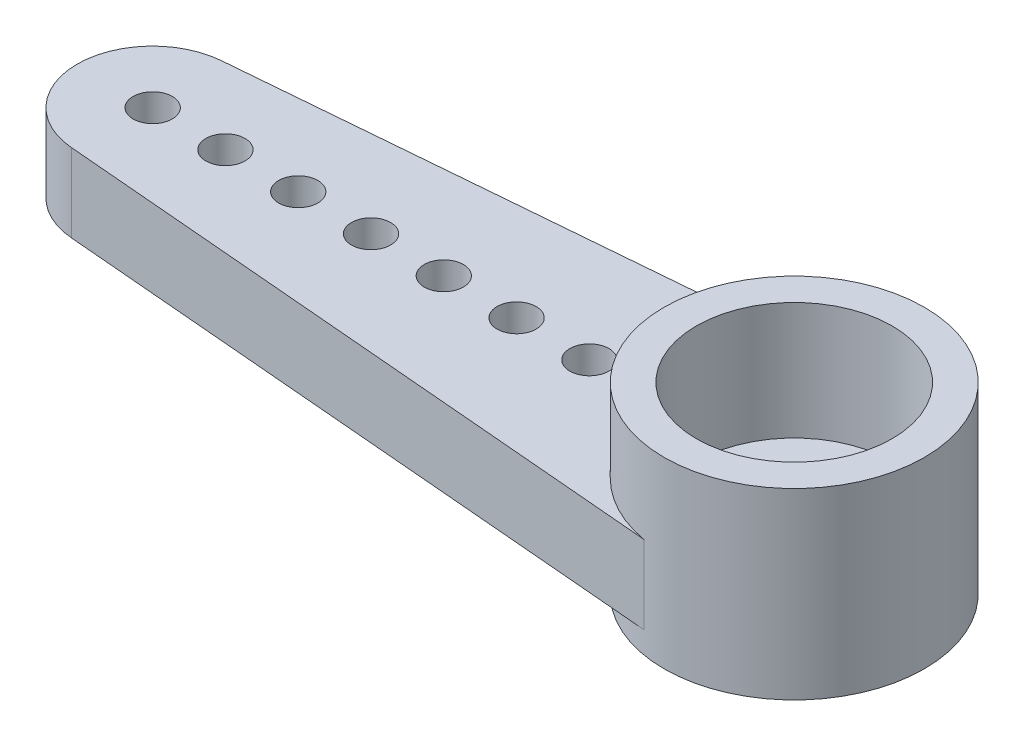
ISO-10303-21;
HEADER;
FILE_DESCRIPTION(('STEP AP214'),'2;1');
FILE_NAME('part.step','',(''),(''),'','','');
FILE_SCHEMA(('AUTOMOTIVE_DESIGN { 1 0 10303 214 1 1 1 1 }'));
ENDSEC;
DATA;
#1=APPLICATION_CONTEXT('core data for automotive mechanical design processes');
#2=APPLICATION_PROTOCOL_DEFINITION('international standard','automotive_design',2000,#1);
#3=PRODUCT_CONTEXT('',#1,'mechanical');
#4=PRODUCT('Part','Part','',(#3));
#5=PRODUCT_RELATED_PRODUCT_CATEGORY('part','',(#4));
#6=PRODUCT_DEFINITION_FORMATION('','',#4);
#7=PRODUCT_DEFINITION_CONTEXT('part definition',#1,'design');
#8=PRODUCT_DEFINITION('design','',#6,#7);
#9=PRODUCT_DEFINITION_SHAPE('','',#8);
#10=(LENGTH_UNIT() NAMED_UNIT(*) SI_UNIT(.MILLI.,.METRE.));
#11=(NAMED_UNIT(*) PLANE_ANGLE_UNIT() SI_UNIT($,.RADIAN.));
#12=(NAMED_UNIT(*) SI_UNIT($,.STERADIAN.) SOLID_ANGLE_UNIT());
#13=UNCERTAINTY_MEASURE_WITH_UNIT(LENGTH_MEASURE(1.E-05),#10,'distance_accuracy_value','');
#14=(GEOMETRIC_REPRESENTATION_CONTEXT(3) GLOBAL_UNCERTAINTY_ASSIGNED_CONTEXT((#13)) GLOBAL_UNIT_ASSIGNED_CONTEXT((#10,
#11,#12)) REPRESENTATION_CONTEXT('',''));
#15=CARTESIAN_POINT('',(0.,0.,0.));
#16=DIRECTION('',(0.,0.,1.));
#17=DIRECTION('',(1.,0.,0.));
#18=AXIS2_PLACEMENT_3D('',#15,#16,#17);
#19=CARTESIAN_POINT('',(0.,2.34,0.));
#20=DIRECTION('',(0.,-1.,0.));
#21=DIRECTION('',(0.,0.,-1.));
#22=AXIS2_PLACEMENT_3D('',#19,#20,#21);
#23=CYLINDRICAL_SURFACE('',#22,3.325);
#24=CARTESIAN_POINT('',(0.,-2.34,0.));
#25=DIRECTION('',(0.,1.,0.));
#26=DIRECTION('',(0.,0.,1.));
#27=AXIS2_PLACEMENT_3D('',#24,#25,#26);
#28=CIRCLE('',#27,3.325);
#29=CARTESIAN_POINT('',(0.,-2.34,3.325));
#30=VERTEX_POINT('',#29);
#31=EDGE_CURVE('E120',#30,#30,#28,.T.);
#32=ORIENTED_EDGE('',*,*,#31,.T.);
#33=EDGE_LOOP('',(#32));
#34=FACE_BOUND('',#33,.T.);
#35=CARTESIAN_POINT('',(0.,2.34,0.));
#36=DIRECTION('',(0.,1.,0.));
#37=DIRECTION('',(0.,0.,1.));
#38=AXIS2_PLACEMENT_3D('',#35,#36,#37);
#39=CIRCLE('',#38,3.325);
#40=CARTESIAN_POINT('',(0.,2.34,3.325));
#41=VERTEX_POINT('',#40);
#42=EDGE_CURVE('E123',#41,#41,#39,.T.);
#43=ORIENTED_EDGE('',*,*,#42,.F.);
#44=EDGE_LOOP('',(#43));
#45=FACE_BOUND('',#44,.T.);
#46=CARTESIAN_POINT('',(0.,-1.78,0.));
#47=DIRECTION('',(0.,1.,0.));
#48=DIRECTION('',(0.,0.,1.));
#49=AXIS2_PLACEMENT_3D('',#46,#47,#48);
#50=CIRCLE('',#49,3.325);
#51=CARTESIAN_POINT('',(-0.560507232356942,-1.78,-3.27741615338601));
#52=VERTEX_POINT('',#51);
#53=CARTESIAN_POINT('',(-0.560507232356942,-1.78,3.27741615338601));
#54=VERTEX_POINT('',#53);
#55=EDGE_CURVE('E11',#52,#54,#50,.T.);
#56=ORIENTED_EDGE('',*,*,#55,.F.);
#57=DIRECTION('',(0.,-1.,0.));
#58=VECTOR('',#57,1.);
#59=CARTESIAN_POINT('',(-0.560507232356942,2.34,-3.27741615338601));
#60=LINE('',#59,#58);
#61=CARTESIAN_POINT('',(-0.560507232356942,0.22,-3.27741615338601));
#62=VERTEX_POINT('',#61);
#63=EDGE_CURVE('E63',#62,#52,#60,.T.);
#64=ORIENTED_EDGE('',*,*,#63,.F.);
#65=CARTESIAN_POINT('',(0.,0.22,0.));
#66=DIRECTION('',(0.,1.,0.));
#67=DIRECTION('',(0.,0.,1.));
#68=AXIS2_PLACEMENT_3D('',#65,#66,#67);
#69=CIRCLE('',#68,3.325);
#70=CARTESIAN_POINT('',(-0.560507232356942,0.22,3.27741615338601));
#71=VERTEX_POINT('',#70);
#72=EDGE_CURVE('E126',#62,#71,#69,.T.);
#73=ORIENTED_EDGE('',*,*,#72,.T.);
#74=DIRECTION('',(0.,-1.,0.));
#75=VECTOR('',#74,1.);
#76=CARTESIAN_POINT('',(-0.560507232356942,2.34,3.27741615338601));
#77=LINE('',#76,#75);
#78=EDGE_CURVE('E47',#54,#71,#77,.F.);
#79=ORIENTED_EDGE('',*,*,#78,.F.);
#80=EDGE_LOOP('',(#56,#64,#73,#79));
#81=FACE_BOUND('',#80,.T.);
#82=ADVANCED_FACE('F39',(#34,#45,#81),#23,.T.);
#83=CARTESIAN_POINT('',(0.,2.34,0.));
#84=DIRECTION('',(0.,1.,0.));
#85=DIRECTION('',(0.,0.,1.));
#86=AXIS2_PLACEMENT_3D('',#83,#84,#85);
#87=PLANE('',#86);
#88=CARTESIAN_POINT('',(0.,2.34,0.));
#89=DIRECTION('',(0.,1.,0.));
#90=DIRECTION('',(0.,0.,1.));
#91=AXIS2_PLACEMENT_3D('',#88,#89,#90);
#92=CIRCLE('',#91,2.5);
#93=CARTESIAN_POINT('',(0.,2.34,2.5));
#94=VERTEX_POINT('',#93);
#95=EDGE_CURVE('E114',#94,#94,#92,.T.);
#96=ORIENTED_EDGE('',*,*,#95,.F.);
#97=EDGE_LOOP('',(#96));
#98=FACE_BOUND('',#97,.T.);
#99=ORIENTED_EDGE('',*,*,#42,.T.);
#100=EDGE_LOOP('',(#99));
#101=FACE_BOUND('',#100,.T.);
#102=ADVANCED_FACE('F177',(#98,#101),#87,.T.);
#103=CARTESIAN_POINT('',(0.,-2.34,0.));
#104=DIRECTION('',(0.,1.,0.));
#105=DIRECTION('',(0.,0.,1.));
#106=AXIS2_PLACEMENT_3D('',#103,#104,#105);
#107=PLANE('',#106);
#108=CARTESIAN_POINT('',(0.,-2.34,0.));
#109=DIRECTION('',(0.,1.,0.));
#110=DIRECTION('',(0.,0.,1.));
#111=AXIS2_PLACEMENT_3D('',#108,#109,#110);
#112=CIRCLE('',#111,1.);
#113=CARTESIAN_POINT('',(0.,-2.34,1.));
#114=VERTEX_POINT('',#113);
#115=EDGE_CURVE('E111',#114,#114,#112,.T.);
#116=ORIENTED_EDGE('',*,*,#115,.T.);
#117=EDGE_LOOP('',(#116));
#118=FACE_BOUND('',#117,.T.);
#119=ORIENTED_EDGE('',*,*,#31,.F.);
#120=EDGE_LOOP('',(#119));
#121=FACE_BOUND('',#120,.T.);
#122=ADVANCED_FACE('F184',(#118,#121),#107,.F.);
#123=CARTESIAN_POINT('',(0.,-0.66,0.));
#124=DIRECTION('',(0.,1.,0.));
#125=DIRECTION('',(0.,0.,1.));
#126=AXIS2_PLACEMENT_3D('',#123,#124,#125);
#127=CYLINDRICAL_SURFACE('',#126,2.5);
#128=CARTESIAN_POINT('',(0.,-0.66,0.));
#129=DIRECTION('',(0.,1.,0.));
#130=DIRECTION('',(0.,0.,1.));
#131=AXIS2_PLACEMENT_3D('',#128,#129,#130);
#132=CIRCLE('',#131,2.5);
#133=CARTESIAN_POINT('',(0.,-0.66,2.5));
#134=VERTEX_POINT('',#133);
#135=EDGE_CURVE('E117',#134,#134,#132,.T.);
#136=ORIENTED_EDGE('',*,*,#135,.F.);
#137=EDGE_LOOP('',(#136));
#138=FACE_BOUND('',#137,.T.);
#139=ORIENTED_EDGE('',*,*,#95,.T.);
#140=EDGE_LOOP('',(#139));
#141=FACE_BOUND('',#140,.T.);
#142=ADVANCED_FACE('F193',(#138,#141),#127,.F.);
#143=CARTESIAN_POINT('',(0.,-0.66,0.));
#144=DIRECTION('',(0.,1.,0.));
#145=DIRECTION('',(0.,0.,1.));
#146=AXIS2_PLACEMENT_3D('',#143,#144,#145);
#147=PLANE('',#146);
#148=CARTESIAN_POINT('',(0.,-0.66,0.));
#149=DIRECTION('',(0.,1.,0.));
#150=DIRECTION('',(0.,0.,1.));
#151=AXIS2_PLACEMENT_3D('',#148,#149,#150);
#152=CIRCLE('',#151,1.);
#153=CARTESIAN_POINT('',(0.,-0.66,1.));
#154=VERTEX_POINT('',#153);
#155=EDGE_CURVE('E96',#154,#154,#152,.T.);
#156=ORIENTED_EDGE('',*,*,#155,.F.);
#157=EDGE_LOOP('',(#156));
#158=FACE_BOUND('',#157,.T.);
#159=ORIENTED_EDGE('',*,*,#135,.T.);
#160=EDGE_LOOP('',(#159));
#161=FACE_BOUND('',#160,.T.);
#162=ADVANCED_FACE('F199',(#158,#161),#147,.T.);
#163=CARTESIAN_POINT('',(0.,-2.34,0.));
#164=DIRECTION('',(0.,1.,0.));
#165=DIRECTION('',(0.,0.,1.));
#166=AXIS2_PLACEMENT_3D('',#163,#164,#165);
#167=CYLINDRICAL_SURFACE('',#166,1.);
#168=ORIENTED_EDGE('',*,*,#115,.F.);
#169=EDGE_LOOP('',(#168));
#170=FACE_BOUND('',#169,.T.);
#171=ORIENTED_EDGE('',*,*,#155,.T.);
#172=EDGE_LOOP('',(#171));
#173=FACE_BOUND('',#172,.T.);
#174=ADVANCED_FACE('F204',(#170,#173),#167,.F.);
#175=CARTESIAN_POINT('',(0.,-1.78,3.325));
#176=DIRECTION('',(0.0845899855552582,0.,-0.996415844085069));
#177=DIRECTION('',(-0.996415844085069,0.,-0.0845899855552582));
#178=AXIS2_PLACEMENT_3D('',#175,#176,#177);
#179=PLANE('',#178);
#180=DIRECTION('',(-0.996415844085069,0.,-0.0845899855552582));
#181=VECTOR('',#180,1.);
#182=CARTESIAN_POINT('',(0.,-1.78,3.325));
#183=LINE('',#182,#181);
#184=CARTESIAN_POINT('',(-16.55,-1.78,1.92));
#185=VERTEX_POINT('',#184);
#186=EDGE_CURVE('E81',#54,#185,#183,.T.);
#187=ORIENTED_EDGE('',*,*,#186,.F.);
#188=ORIENTED_EDGE('',*,*,#78,.T.);
#189=DIRECTION('',(-0.996415844085069,0.,-0.0845899855552582));
#190=VECTOR('',#189,1.);
#191=CARTESIAN_POINT('',(0.,0.22,3.325));
#192=LINE('',#191,#190);
#193=CARTESIAN_POINT('',(-16.55,0.22,1.92));
#194=VERTEX_POINT('',#193);
#195=EDGE_CURVE('E55',#71,#194,#192,.T.);
#196=ORIENTED_EDGE('',*,*,#195,.T.);
#197=DIRECTION('',(0.,1.,0.));
#198=VECTOR('',#197,1.);
#199=CARTESIAN_POINT('',(-16.55,-1.78,1.92));
#200=LINE('',#199,#198);
#201=EDGE_CURVE('E93',#185,#194,#200,.T.);
#202=ORIENTED_EDGE('',*,*,#201,.F.);
#203=EDGE_LOOP('',(#187,#188,#196,#202));
#204=FACE_BOUND('',#203,.T.);
#205=ADVANCED_FACE('F94',(#204),#179,.F.);
#206=CARTESIAN_POINT('',(0.,-1.78,-3.325));
#207=DIRECTION('',(0.0845899855552582,0.,0.996415844085069));
#208=DIRECTION('',(0.996415844085069,0.,-0.0845899855552582));
#209=AXIS2_PLACEMENT_3D('',#206,#207,#208);
#210=PLANE('',#209);
#211=DIRECTION('',(0.996415844085069,0.,-0.0845899855552582));
#212=VECTOR('',#211,1.);
#213=CARTESIAN_POINT('',(0.,0.22,-3.325));
#214=LINE('',#213,#212);
#215=CARTESIAN_POINT('',(-16.55,0.22,-1.92));
#216=VERTEX_POINT('',#215);
#217=EDGE_CURVE('E90',#216,#62,#214,.T.);
#218=ORIENTED_EDGE('',*,*,#217,.T.);
#219=ORIENTED_EDGE('',*,*,#63,.T.);
#220=DIRECTION('',(0.996415844085069,0.,-0.0845899855552582));
#221=VECTOR('',#220,1.);
#222=CARTESIAN_POINT('',(0.,-1.78,-3.325));
#223=LINE('',#222,#221);
#224=CARTESIAN_POINT('',(-16.55,-1.78,-1.92));
#225=VERTEX_POINT('',#224);
#226=EDGE_CURVE('E101',#225,#52,#223,.T.);
#227=ORIENTED_EDGE('',*,*,#226,.F.);
#228=DIRECTION('',(0.,1.,0.));
#229=VECTOR('',#228,1.);
#230=CARTESIAN_POINT('',(-16.55,-1.78,-1.92));
#231=LINE('',#230,#229);
#232=EDGE_CURVE('E97',#225,#216,#231,.T.);
#233=ORIENTED_EDGE('',*,*,#232,.T.);
#234=EDGE_LOOP('',(#218,#219,#227,#233));
#235=FACE_BOUND('',#234,.T.);
#236=ADVANCED_FACE('F175',(#235),#210,.F.);
#237=CARTESIAN_POINT('',(-16.3990774647887,-1.78,0.));
#238=DIRECTION('',(0.,1.,0.));
#239=DIRECTION('',(0.,0.,1.));
#240=AXIS2_PLACEMENT_3D('',#237,#238,#239);
#241=CYLINDRICAL_SURFACE('',#240,1.92592253521127);
#242=CARTESIAN_POINT('',(-16.3990774647887,0.22,0.));
#243=DIRECTION('',(0.,-1.,0.));
#244=DIRECTION('',(0.,0.,1.));
#245=AXIS2_PLACEMENT_3D('',#242,#243,#244);
#246=CIRCLE('',#245,1.92592253521127);
#247=EDGE_CURVE('E107',#194,#216,#246,.T.);
#248=ORIENTED_EDGE('',*,*,#247,.T.);
#249=ORIENTED_EDGE('',*,*,#232,.F.);
#250=CARTESIAN_POINT('',(-16.3990774647887,-1.78,0.));
#251=DIRECTION('',(0.,-1.,0.));
#252=DIRECTION('',(0.,0.,1.));
#253=AXIS2_PLACEMENT_3D('',#250,#251,#252);
#254=CIRCLE('',#253,1.92592253521127);
#255=EDGE_CURVE('E85',#185,#225,#254,.T.);
#256=ORIENTED_EDGE('',*,*,#255,.F.);
#257=ORIENTED_EDGE('',*,*,#201,.T.);
#258=EDGE_LOOP('',(#248,#249,#256,#257));
#259=FACE_BOUND('',#258,.T.);
#260=ADVANCED_FACE('F99',(#259),#241,.T.);
#261=CARTESIAN_POINT('',(0.870997173107983,-1.78,0.));
#262=DIRECTION('',(0.,1.,0.));
#263=DIRECTION('',(0.,0.,1.));
#264=AXIS2_PLACEMENT_3D('',#261,#262,#263);
#265=PLANE('',#264);
#266=CARTESIAN_POINT('',(-16.395,-1.78,0.));
#267=DIRECTION('',(0.,-1.,0.));
#268=DIRECTION('',(0.,0.,-1.));
#269=AXIS2_PLACEMENT_3D('',#266,#267,#268);
#270=CIRCLE('',#269,0.499999999999999);
#271=CARTESIAN_POINT('',(-16.395,-1.78,-0.499999999999999));
#272=VERTEX_POINT('',#271);
#273=EDGE_CURVE('E137',#272,#272,#270,.T.);
#274=ORIENTED_EDGE('',*,*,#273,.F.);
#275=EDGE_LOOP('',(#274));
#276=FACE_BOUND('',#275,.T.);
#277=CARTESIAN_POINT('',(-5.235,-1.78,0.));
#278=DIRECTION('',(0.,-1.,0.));
#279=DIRECTION('',(0.,0.,-1.));
#280=AXIS2_PLACEMENT_3D('',#277,#278,#279);
#281=CIRCLE('',#280,0.500000000000001);
#282=CARTESIAN_POINT('',(-5.235,-1.78,-0.499999999999999));
#283=VERTEX_POINT('',#282);
#284=EDGE_CURVE('E349',#283,#283,#281,.T.);
#285=ORIENTED_EDGE('',*,*,#284,.F.);
#286=EDGE_LOOP('',(#285));
#287=FACE_BOUND('',#286,.T.);
#288=CARTESIAN_POINT('',(-8.955,-1.78,0.));
#289=DIRECTION('',(0.,-1.,0.));
#290=DIRECTION('',(0.,0.,-1.));
#291=AXIS2_PLACEMENT_3D('',#288,#289,#290);
#292=CIRCLE('',#291,0.500000000000001);
#293=CARTESIAN_POINT('',(-8.955,-1.78,-0.5));
#294=VERTEX_POINT('',#293);
#295=EDGE_CURVE('E346',#294,#294,#292,.T.);
#296=ORIENTED_EDGE('',*,*,#295,.F.);
#297=EDGE_LOOP('',(#296));
#298=FACE_BOUND('',#297,.T.);
#299=CARTESIAN_POINT('',(-7.095,-1.78,0.));
#300=DIRECTION('',(0.,-1.,0.));
#301=DIRECTION('',(0.,0.,-1.));
#302=AXIS2_PLACEMENT_3D('',#299,#300,#301);
#303=CIRCLE('',#302,0.500000000000001);
#304=CARTESIAN_POINT('',(-7.095,-1.78,-0.499999999999999));
#305=VERTEX_POINT('',#304);
#306=EDGE_CURVE('E361',#305,#305,#303,.T.);
#307=ORIENTED_EDGE('',*,*,#306,.F.);
#308=EDGE_LOOP('',(#307));
#309=FACE_BOUND('',#308,.T.);
#310=CARTESIAN_POINT('',(-14.535,-1.78,0.));
#311=DIRECTION('',(0.,-1.,0.));
#312=DIRECTION('',(0.,0.,-1.));
#313=AXIS2_PLACEMENT_3D('',#310,#311,#312);
#314=CIRCLE('',#313,0.500000000000001);
#315=CARTESIAN_POINT('',(-14.535,-1.78,-0.5));
#316=VERTEX_POINT('',#315);
#317=EDGE_CURVE('E359',#316,#316,#314,.T.);
#318=ORIENTED_EDGE('',*,*,#317,.F.);
#319=EDGE_LOOP('',(#318));
#320=FACE_BOUND('',#319,.T.);
#321=CARTESIAN_POINT('',(-12.675,-1.78,0.));
#322=DIRECTION('',(0.,-1.,0.));
#323=DIRECTION('',(0.,0.,-1.));
#324=AXIS2_PLACEMENT_3D('',#321,#322,#323);
#325=CIRCLE('',#324,0.500000000000001);
#326=CARTESIAN_POINT('',(-12.675,-1.78,-0.5));
#327=VERTEX_POINT('',#326);
#328=EDGE_CURVE('E352',#327,#327,#325,.T.);
#329=ORIENTED_EDGE('',*,*,#328,.F.);
#330=EDGE_LOOP('',(#329));
#331=FACE_BOUND('',#330,.T.);
#332=CARTESIAN_POINT('',(-10.815,-1.78,0.));
#333=DIRECTION('',(0.,-1.,0.));
#334=DIRECTION('',(0.,0.,-1.));
#335=AXIS2_PLACEMENT_3D('',#332,#333,#334);
#336=CIRCLE('',#335,0.500000000000001);
#337=CARTESIAN_POINT('',(-10.815,-1.78,-0.5));
#338=VERTEX_POINT('',#337);
#339=EDGE_CURVE('E348',#338,#338,#336,.T.);
#340=ORIENTED_EDGE('',*,*,#339,.F.);
#341=EDGE_LOOP('',(#340));
#342=FACE_BOUND('',#341,.T.);
#343=ORIENTED_EDGE('',*,*,#226,.T.);
#344=ORIENTED_EDGE('',*,*,#55,.T.);
#345=ORIENTED_EDGE('',*,*,#186,.T.);
#346=ORIENTED_EDGE('',*,*,#255,.T.);
#347=EDGE_LOOP('',(#343,#344,#345,#346));
#348=FACE_BOUND('',#347,.T.);
#349=ADVANCED_FACE('F83',(#276,#287,#298,#309,#320,#331,#342,#348),#265,.F.);
#350=CARTESIAN_POINT('',(0.870997173107983,0.22,0.));
#351=DIRECTION('',(0.,1.,0.));
#352=DIRECTION('',(0.,0.,1.));
#353=AXIS2_PLACEMENT_3D('',#350,#351,#352);
#354=PLANE('',#353);
#355=CARTESIAN_POINT('',(-16.395,0.22,0.));
#356=DIRECTION('',(0.,1.,0.));
#357=DIRECTION('',(0.,0.,1.));
#358=AXIS2_PLACEMENT_3D('',#355,#356,#357);
#359=CIRCLE('',#358,0.499999999999999);
#360=CARTESIAN_POINT('',(-16.395,0.22,0.499999999999999));
#361=VERTEX_POINT('',#360);
#362=EDGE_CURVE('E42',#361,#361,#359,.T.);
#363=ORIENTED_EDGE('',*,*,#362,.F.);
#364=EDGE_LOOP('',(#363));
#365=FACE_BOUND('',#364,.T.);
#366=CARTESIAN_POINT('',(-5.235,0.22,0.));
#367=DIRECTION('',(0.,1.,0.));
#368=DIRECTION('',(0.,0.,1.));
#369=AXIS2_PLACEMENT_3D('',#366,#367,#368);
#370=CIRCLE('',#369,0.500000000000001);
#371=CARTESIAN_POINT('',(-5.235,0.22,0.500000000000002));
#372=VERTEX_POINT('',#371);
#373=EDGE_CURVE('E148',#372,#372,#370,.T.);
#374=ORIENTED_EDGE('',*,*,#373,.F.);
#375=EDGE_LOOP('',(#374));
#376=FACE_BOUND('',#375,.T.);
#377=CARTESIAN_POINT('',(-8.955,0.22,0.));
#378=DIRECTION('',(0.,1.,0.));
#379=DIRECTION('',(0.,0.,1.));
#380=AXIS2_PLACEMENT_3D('',#377,#378,#379);
#381=CIRCLE('',#380,0.500000000000001);
#382=CARTESIAN_POINT('',(-8.955,0.22,0.500000000000002));
#383=VERTEX_POINT('',#382);
#384=EDGE_CURVE('E146',#383,#383,#381,.T.);
#385=ORIENTED_EDGE('',*,*,#384,.F.);
#386=EDGE_LOOP('',(#385));
#387=FACE_BOUND('',#386,.T.);
#388=CARTESIAN_POINT('',(-7.095,0.22,0.));
#389=DIRECTION('',(0.,1.,0.));
#390=DIRECTION('',(0.,0.,1.));
#391=AXIS2_PLACEMENT_3D('',#388,#389,#390);
#392=CIRCLE('',#391,0.500000000000001);
#393=CARTESIAN_POINT('',(-7.095,0.22,0.500000000000002));
#394=VERTEX_POINT('',#393);
#395=EDGE_CURVE('E143',#394,#394,#392,.T.);
#396=ORIENTED_EDGE('',*,*,#395,.F.);
#397=EDGE_LOOP('',(#396));
#398=FACE_BOUND('',#397,.T.);
#399=CARTESIAN_POINT('',(-14.535,0.22,0.));
#400=DIRECTION('',(0.,1.,0.));
#401=DIRECTION('',(0.,0.,1.));
#402=AXIS2_PLACEMENT_3D('',#399,#400,#401);
#403=CIRCLE('',#402,0.500000000000001);
#404=CARTESIAN_POINT('',(-14.535,0.22,0.500000000000001));
#405=VERTEX_POINT('',#404);
#406=EDGE_CURVE('E140',#405,#405,#403,.T.);
#407=ORIENTED_EDGE('',*,*,#406,.F.);
#408=EDGE_LOOP('',(#407));
#409=FACE_BOUND('',#408,.T.);
#410=CARTESIAN_POINT('',(-12.675,0.22,0.));
#411=DIRECTION('',(0.,1.,0.));
#412=DIRECTION('',(0.,0.,1.));
#413=AXIS2_PLACEMENT_3D('',#410,#411,#412);
#414=CIRCLE('',#413,0.500000000000001);
#415=CARTESIAN_POINT('',(-12.675,0.22,0.500000000000001));
#416=VERTEX_POINT('',#415);
#417=EDGE_CURVE('E136',#416,#416,#414,.T.);
#418=ORIENTED_EDGE('',*,*,#417,.F.);
#419=EDGE_LOOP('',(#418));
#420=FACE_BOUND('',#419,.T.);
#421=CARTESIAN_POINT('',(-10.815,0.22,0.));
#422=DIRECTION('',(0.,1.,0.));
#423=DIRECTION('',(0.,0.,1.));
#424=AXIS2_PLACEMENT_3D('',#421,#422,#423);
#425=CIRCLE('',#424,0.500000000000001);
#426=CARTESIAN_POINT('',(-10.815,0.22,0.500000000000002));
#427=VERTEX_POINT('',#426);
#428=EDGE_CURVE('E133',#427,#427,#425,.T.);
#429=ORIENTED_EDGE('',*,*,#428,.F.);
#430=EDGE_LOOP('',(#429));
#431=FACE_BOUND('',#430,.T.);
#432=ORIENTED_EDGE('',*,*,#72,.F.);
#433=ORIENTED_EDGE('',*,*,#217,.F.);
#434=ORIENTED_EDGE('',*,*,#247,.F.);
#435=ORIENTED_EDGE('',*,*,#195,.F.);
#436=EDGE_LOOP('',(#432,#433,#434,#435));
#437=FACE_BOUND('',#436,.T.);
#438=ADVANCED_FACE('F158',(#365,#376,#387,#398,#409,#420,#431,#437),#354,.T.);
#439=CARTESIAN_POINT('',(-10.815,8.22,0.));
#440=DIRECTION('',(0.,-1.,0.));
#441=DIRECTION('',(0.,0.,-1.));
#442=AXIS2_PLACEMENT_3D('',#439,#440,#441);
#443=CYLINDRICAL_SURFACE('',#442,0.500000000000001);
#444=ORIENTED_EDGE('',*,*,#428,.T.);
#445=EDGE_LOOP('',(#444));
#446=FACE_BOUND('',#445,.T.);
#447=ORIENTED_EDGE('',*,*,#339,.T.);
#448=EDGE_LOOP('',(#447));
#449=FACE_BOUND('',#448,.T.);
#450=ADVANCED_FACE('F161',(#446,#449),#443,.F.);
#451=CARTESIAN_POINT('',(-12.675,8.22,0.));
#452=DIRECTION('',(0.,-1.,0.));
#453=DIRECTION('',(0.,0.,-1.));
#454=AXIS2_PLACEMENT_3D('',#451,#452,#453);
#455=CYLINDRICAL_SURFACE('',#454,0.500000000000001);
#456=ORIENTED_EDGE('',*,*,#417,.T.);
#457=EDGE_LOOP('',(#456));
#458=FACE_BOUND('',#457,.T.);
#459=ORIENTED_EDGE('',*,*,#328,.T.);
#460=EDGE_LOOP('',(#459));
#461=FACE_BOUND('',#460,.T.);
#462=ADVANCED_FACE('F220',(#458,#461),#455,.F.);
#463=CARTESIAN_POINT('',(-14.535,8.22,0.));
#464=DIRECTION('',(0.,-1.,0.));
#465=DIRECTION('',(0.,0.,-1.));
#466=AXIS2_PLACEMENT_3D('',#463,#464,#465);
#467=CYLINDRICAL_SURFACE('',#466,0.500000000000001);
#468=ORIENTED_EDGE('',*,*,#406,.T.);
#469=EDGE_LOOP('',(#468));
#470=FACE_BOUND('',#469,.T.);
#471=ORIENTED_EDGE('',*,*,#317,.T.);
#472=EDGE_LOOP('',(#471));
#473=FACE_BOUND('',#472,.T.);
#474=ADVANCED_FACE('F216',(#470,#473),#467,.F.);
#475=CARTESIAN_POINT('',(-7.095,8.22,0.));
#476=DIRECTION('',(0.,-1.,0.));
#477=DIRECTION('',(0.,0.,-1.));
#478=AXIS2_PLACEMENT_3D('',#475,#476,#477);
#479=CYLINDRICAL_SURFACE('',#478,0.500000000000001);
#480=ORIENTED_EDGE('',*,*,#395,.T.);
#481=EDGE_LOOP('',(#480));
#482=FACE_BOUND('',#481,.T.);
#483=ORIENTED_EDGE('',*,*,#306,.T.);
#484=EDGE_LOOP('',(#483));
#485=FACE_BOUND('',#484,.T.);
#486=ADVANCED_FACE('F219',(#482,#485),#479,.F.);
#487=CARTESIAN_POINT('',(-8.955,8.22,0.));
#488=DIRECTION('',(0.,-1.,0.));
#489=DIRECTION('',(0.,0.,-1.));
#490=AXIS2_PLACEMENT_3D('',#487,#488,#489);
#491=CYLINDRICAL_SURFACE('',#490,0.500000000000001);
#492=ORIENTED_EDGE('',*,*,#384,.T.);
#493=EDGE_LOOP('',(#492));
#494=FACE_BOUND('',#493,.T.);
#495=ORIENTED_EDGE('',*,*,#295,.T.);
#496=EDGE_LOOP('',(#495));
#497=FACE_BOUND('',#496,.T.);
#498=ADVANCED_FACE('F224',(#494,#497),#491,.F.);
#499=CARTESIAN_POINT('',(-5.235,8.22,0.));
#500=DIRECTION('',(0.,-1.,0.));
#501=DIRECTION('',(0.,0.,-1.));
#502=AXIS2_PLACEMENT_3D('',#499,#500,#501);
#503=CYLINDRICAL_SURFACE('',#502,0.500000000000001);
#504=ORIENTED_EDGE('',*,*,#373,.T.);
#505=EDGE_LOOP('',(#504));
#506=FACE_BOUND('',#505,.T.);
#507=ORIENTED_EDGE('',*,*,#284,.T.);
#508=EDGE_LOOP('',(#507));
#509=FACE_BOUND('',#508,.T.);
#510=ADVANCED_FACE('F232',(#506,#509),#503,.F.);
#511=CARTESIAN_POINT('',(-16.395,8.22,0.));
#512=DIRECTION('',(0.,-1.,0.));
#513=DIRECTION('',(0.,0.,-1.));
#514=AXIS2_PLACEMENT_3D('',#511,#512,#513);
#515=CYLINDRICAL_SURFACE('',#514,0.499999999999999);
#516=ORIENTED_EDGE('',*,*,#362,.T.);
#517=EDGE_LOOP('',(#516));
#518=FACE_BOUND('',#517,.T.);
#519=ORIENTED_EDGE('',*,*,#273,.T.);
#520=EDGE_LOOP('',(#519));
#521=FACE_BOUND('',#520,.T.);
#522=ADVANCED_FACE('F155',(#518,#521),#515,.F.);
#523=CLOSED_SHELL('',(#82,#102,#122,#142,#162,#174,#205,#236,#260,#349,#438,#450,#462,#474,#486,
#498,#510,#522));
#524=MANIFOLD_SOLID_BREP('B2',#523);
#525=ADVANCED_BREP_SHAPE_REPRESENTATION('',(#18,#524),#14);
#526=SHAPE_DEFINITION_REPRESENTATION(#9,#525);
ENDSEC;
END-ISO-10303-21;
